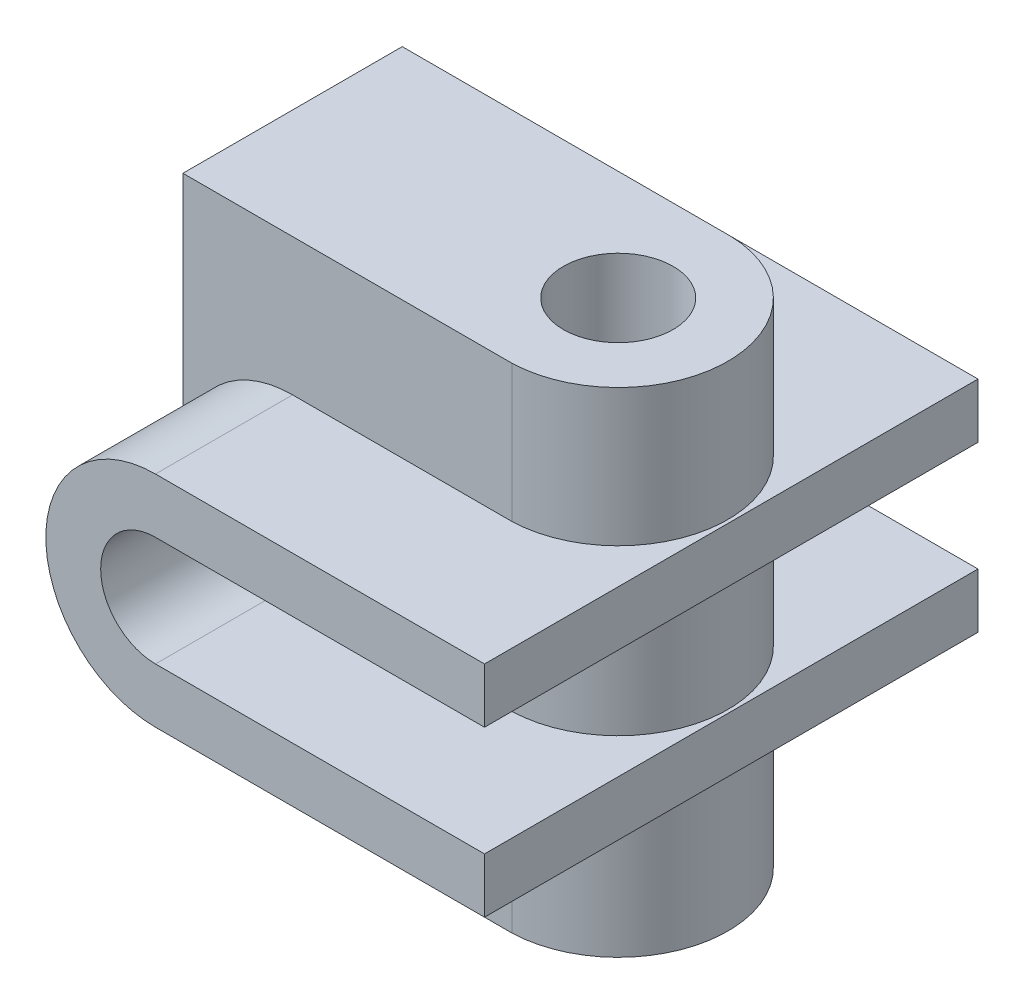
ISO-10303-21;
HEADER;
FILE_DESCRIPTION(('STEP AP214'),'2;1');
FILE_NAME('part.step','',(''),(''),'','','');
FILE_SCHEMA(('AUTOMOTIVE_DESIGN { 1 0 10303 214 1 1 1 1 }'));
ENDSEC;
DATA;
#1=APPLICATION_CONTEXT('core data for automotive mechanical design processes');
#2=APPLICATION_PROTOCOL_DEFINITION('international standard','automotive_design',2000,#1);
#3=PRODUCT_CONTEXT('',#1,'mechanical');
#4=PRODUCT('Part','Part','',(#3));
#5=PRODUCT_RELATED_PRODUCT_CATEGORY('part','',(#4));
#6=PRODUCT_DEFINITION_FORMATION('','',#4);
#7=PRODUCT_DEFINITION_CONTEXT('part definition',#1,'design');
#8=PRODUCT_DEFINITION('design','',#6,#7);
#9=PRODUCT_DEFINITION_SHAPE('','',#8);
#10=(LENGTH_UNIT() NAMED_UNIT(*) SI_UNIT(.MILLI.,.METRE.));
#11=(NAMED_UNIT(*) PLANE_ANGLE_UNIT() SI_UNIT($,.RADIAN.));
#12=(NAMED_UNIT(*) SI_UNIT($,.STERADIAN.) SOLID_ANGLE_UNIT());
#13=UNCERTAINTY_MEASURE_WITH_UNIT(LENGTH_MEASURE(1.E-05),#10,'distance_accuracy_value','');
#14=(GEOMETRIC_REPRESENTATION_CONTEXT(3) GLOBAL_UNCERTAINTY_ASSIGNED_CONTEXT((#13)) GLOBAL_UNIT_ASSIGNED_CONTEXT((#10,
#11,#12)) REPRESENTATION_CONTEXT('',''));
#15=CARTESIAN_POINT('',(0.,0.,0.));
#16=DIRECTION('',(0.,0.,1.));
#17=DIRECTION('',(1.,0.,0.));
#18=AXIS2_PLACEMENT_3D('',#15,#16,#17);
#19=CARTESIAN_POINT('',(0.,0.,90.));
#20=DIRECTION('',(0.,0.,-1.));
#21=DIRECTION('',(-1.,0.,0.));
#22=AXIS2_PLACEMENT_3D('',#19,#20,#21);
#23=CYLINDRICAL_SURFACE('',#22,20.);
#24=CARTESIAN_POINT('',(0.,0.,65.0000000000001));
#25=DIRECTION('',(0.,0.,1.));
#26=DIRECTION('',(1.,0.,0.));
#27=AXIS2_PLACEMENT_3D('',#24,#25,#26);
#28=CIRCLE('',#27,20.);
#29=CARTESIAN_POINT('',(-20.,0.,65.0000000000001));
#30=VERTEX_POINT('',#29);
#31=CARTESIAN_POINT('',(0.,20.,65.0000000000001));
#32=VERTEX_POINT('',#31);
#33=EDGE_CURVE('E284',#30,#32,#28,.F.);
#34=ORIENTED_EDGE('',*,*,#33,.F.);
#35=CARTESIAN_POINT('',(0.,-20.,65.0000000000001));
#36=VERTEX_POINT('',#35);
#37=EDGE_CURVE('E280',#36,#30,#28,.F.);
#38=ORIENTED_EDGE('',*,*,#37,.F.);
#39=DIRECTION('',(0.,0.,-1.));
#40=VECTOR('',#39,1.);
#41=CARTESIAN_POINT('',(0.,-20.,90.));
#42=LINE('',#41,#40);
#43=CARTESIAN_POINT('',(0.,-20.,90.));
#44=VERTEX_POINT('',#43);
#45=EDGE_CURVE('E402',#44,#36,#42,.T.);
#46=ORIENTED_EDGE('',*,*,#45,.F.);
#47=CARTESIAN_POINT('',(0.,0.,90.));
#48=DIRECTION('',(0.,0.,-1.));
#49=DIRECTION('',(1.,0.,0.));
#50=AXIS2_PLACEMENT_3D('',#47,#48,#49);
#51=CIRCLE('',#50,20.);
#52=CARTESIAN_POINT('',(0.,20.,90.));
#53=VERTEX_POINT('',#52);
#54=EDGE_CURVE('E337',#44,#53,#51,.T.);
#55=ORIENTED_EDGE('',*,*,#54,.T.);
#56=DIRECTION('',(0.,0.,-1.));
#57=VECTOR('',#56,1.);
#58=CARTESIAN_POINT('',(0.,20.,90.));
#59=LINE('',#58,#57);
#60=EDGE_CURVE('E406',#53,#32,#59,.T.);
#61=ORIENTED_EDGE('',*,*,#60,.T.);
#62=EDGE_LOOP('',(#34,#38,#46,#55,#61));
#63=FACE_BOUND('',#62,.T.);
#64=ADVANCED_FACE('F46',(#63),#23,.T.);
#65=CARTESIAN_POINT('',(0.,0.,90.));
#66=DIRECTION('',(0.,0.,-1.));
#67=DIRECTION('',(-1.,0.,0.));
#68=AXIS2_PLACEMENT_3D('',#65,#66,#67);
#69=CYLINDRICAL_SURFACE('',#68,10.);
#70=DIRECTION('',(0.,0.,-1.));
#71=VECTOR('',#70,1.);
#72=CARTESIAN_POINT('',(0.,10.,90.));
#73=LINE('',#72,#71);
#74=CARTESIAN_POINT('',(0.,10.,25.0000000000001));
#75=VERTEX_POINT('',#74);
#76=CARTESIAN_POINT('',(0.,10.,0.));
#77=VERTEX_POINT('',#76);
#78=EDGE_CURVE('E355',#75,#77,#73,.T.);
#79=ORIENTED_EDGE('',*,*,#78,.F.);
#80=CARTESIAN_POINT('',(0.,0.,25.0000000000001));
#81=DIRECTION('',(0.,0.,-1.));
#82=DIRECTION('',(-1.,0.,0.));
#83=AXIS2_PLACEMENT_3D('',#80,#81,#82);
#84=CIRCLE('',#83,10.);
#85=CARTESIAN_POINT('',(0.,-10.,25.0000000000001));
#86=VERTEX_POINT('',#85);
#87=EDGE_CURVE('E420',#75,#86,#84,.F.);
#88=ORIENTED_EDGE('',*,*,#87,.T.);
#89=DIRECTION('',(0.,0.,-1.));
#90=VECTOR('',#89,1.);
#91=CARTESIAN_POINT('',(0.,-10.,90.));
#92=LINE('',#91,#90);
#93=CARTESIAN_POINT('',(0.,-10.,0.));
#94=VERTEX_POINT('',#93);
#95=EDGE_CURVE('E390',#86,#94,#92,.T.);
#96=ORIENTED_EDGE('',*,*,#95,.T.);
#97=CARTESIAN_POINT('',(0.,0.,0.));
#98=DIRECTION('',(0.,0.,1.));
#99=DIRECTION('',(1.,0.,0.));
#100=AXIS2_PLACEMENT_3D('',#97,#98,#99);
#101=CIRCLE('',#100,10.);
#102=EDGE_CURVE('E329',#94,#77,#101,.F.);
#103=ORIENTED_EDGE('',*,*,#102,.T.);
#104=EDGE_LOOP('',(#79,#88,#96,#103));
#105=FACE_BOUND('',#104,.T.);
#106=ADVANCED_FACE('F510',(#105),#69,.F.);
#107=CARTESIAN_POINT('',(0.,10.,90.));
#108=DIRECTION('',(0.,1.,0.));
#109=DIRECTION('',(0.,0.,1.));
#110=AXIS2_PLACEMENT_3D('',#107,#108,#109);
#111=PLANE('',#110);
#112=CARTESIAN_POINT('',(39.3871556719854,10.,45.0000000000001));
#113=DIRECTION('',(0.,1.,0.));
#114=DIRECTION('',(0.,0.,1.));
#115=AXIS2_PLACEMENT_3D('',#112,#113,#114);
#116=CIRCLE('',#115,20.0093872512473);
#117=CARTESIAN_POINT('',(40.,9.99999999999999,65.0000000000001));
#118=VERTEX_POINT('',#117);
#119=CARTESIAN_POINT('',(40.,9.99999999999999,25.0000000000001));
#120=VERTEX_POINT('',#119);
#121=EDGE_CURVE('E320',#118,#120,#116,.T.);
#122=ORIENTED_EDGE('',*,*,#121,.T.);
#123=DIRECTION('',(-1.,0.,0.));
#124=VECTOR('',#123,1.);
#125=CARTESIAN_POINT('',(0.,10.,25.0000000000001));
#126=LINE('',#125,#124);
#127=EDGE_CURVE('E292',#120,#75,#126,.T.);
#128=ORIENTED_EDGE('',*,*,#127,.T.);
#129=ORIENTED_EDGE('',*,*,#78,.T.);
#130=DIRECTION('',(1.,0.,0.));
#131=VECTOR('',#130,1.);
#132=CARTESIAN_POINT('',(0.,10.,0.));
#133=LINE('',#132,#131);
#134=CARTESIAN_POINT('',(60.,10.,0.));
#135=VERTEX_POINT('',#134);
#136=EDGE_CURVE('E324',#77,#135,#133,.T.);
#137=ORIENTED_EDGE('',*,*,#136,.T.);
#138=DIRECTION('',(0.,0.,-1.));
#139=VECTOR('',#138,1.);
#140=CARTESIAN_POINT('',(60.,10.,90.));
#141=LINE('',#140,#139);
#142=CARTESIAN_POINT('',(60.,10.,90.));
#143=VERTEX_POINT('',#142);
#144=EDGE_CURVE('E413',#143,#135,#141,.T.);
#145=ORIENTED_EDGE('',*,*,#144,.F.);
#146=DIRECTION('',(1.,0.,0.));
#147=VECTOR('',#146,1.);
#148=CARTESIAN_POINT('',(0.,10.,90.));
#149=LINE('',#148,#147);
#150=CARTESIAN_POINT('',(0.,10.,90.));
#151=VERTEX_POINT('',#150);
#152=EDGE_CURVE('E325',#151,#143,#149,.T.);
#153=ORIENTED_EDGE('',*,*,#152,.F.);
#154=CARTESIAN_POINT('',(0.,10.,65.0000000000001));
#155=VERTEX_POINT('',#154);
#156=EDGE_CURVE('E386',#151,#155,#73,.T.);
#157=ORIENTED_EDGE('',*,*,#156,.T.);
#158=DIRECTION('',(1.,0.,0.));
#159=VECTOR('',#158,1.);
#160=CARTESIAN_POINT('',(0.,10.,65.0000000000001));
#161=LINE('',#160,#159);
#162=EDGE_CURVE('E272',#155,#118,#161,.T.);
#163=ORIENTED_EDGE('',*,*,#162,.T.);
#164=EDGE_LOOP('',(#122,#128,#129,#137,#145,#153,#157,#163));
#165=FACE_BOUND('',#164,.T.);
#166=ADVANCED_FACE('F48',(#165),#111,.F.);
#167=CARTESIAN_POINT('',(60.,20.,90.));
#168=DIRECTION('',(1.,0.,0.));
#169=DIRECTION('',(0.,0.,-1.));
#170=AXIS2_PLACEMENT_3D('',#167,#168,#169);
#171=PLANE('',#170);
#172=DIRECTION('',(0.,-1.,0.));
#173=VECTOR('',#172,1.);
#174=CARTESIAN_POINT('',(60.,20.,0.));
#175=LINE('',#174,#173);
#176=CARTESIAN_POINT('',(60.,20.,0.));
#177=VERTEX_POINT('',#176);
#178=EDGE_CURVE('E359',#177,#135,#175,.T.);
#179=ORIENTED_EDGE('',*,*,#178,.F.);
#180=DIRECTION('',(0.,0.,-1.));
#181=VECTOR('',#180,1.);
#182=CARTESIAN_POINT('',(60.,20.,90.));
#183=LINE('',#182,#181);
#184=CARTESIAN_POINT('',(60.,20.,90.));
#185=VERTEX_POINT('',#184);
#186=EDGE_CURVE('E410',#185,#177,#183,.T.);
#187=ORIENTED_EDGE('',*,*,#186,.F.);
#188=DIRECTION('',(0.,-1.,0.));
#189=VECTOR('',#188,1.);
#190=CARTESIAN_POINT('',(60.,20.,90.));
#191=LINE('',#190,#189);
#192=EDGE_CURVE('E328',#185,#143,#191,.T.);
#193=ORIENTED_EDGE('',*,*,#192,.T.);
#194=ORIENTED_EDGE('',*,*,#144,.T.);
#195=EDGE_LOOP('',(#179,#187,#193,#194));
#196=FACE_BOUND('',#195,.T.);
#197=ADVANCED_FACE('F507',(#196),#171,.T.);
#198=CARTESIAN_POINT('',(0.,20.,90.));
#199=DIRECTION('',(0.,1.,0.));
#200=DIRECTION('',(0.,0.,1.));
#201=AXIS2_PLACEMENT_3D('',#198,#199,#200);
#202=PLANE('',#201);
#203=DIRECTION('',(-1.,0.,0.));
#204=VECTOR('',#203,1.);
#205=CARTESIAN_POINT('',(0.,20.,25.0000000000001));
#206=LINE('',#205,#204);
#207=CARTESIAN_POINT('',(40.,20.,25.0000000000001));
#208=VERTEX_POINT('',#207);
#209=CARTESIAN_POINT('',(0.,20.,25.0000000000001));
#210=VERTEX_POINT('',#209);
#211=EDGE_CURVE('E64',#208,#210,#206,.T.);
#212=ORIENTED_EDGE('',*,*,#211,.F.);
#213=CARTESIAN_POINT('',(39.3871556719854,20.,45.0000000000001));
#214=DIRECTION('',(0.,1.,0.));
#215=DIRECTION('',(0.,0.,1.));
#216=AXIS2_PLACEMENT_3D('',#213,#214,#215);
#217=CIRCLE('',#216,20.0093872512473);
#218=CARTESIAN_POINT('',(40.,20.,65.0000000000001));
#219=VERTEX_POINT('',#218);
#220=EDGE_CURVE('E68',#219,#208,#217,.T.);
#221=ORIENTED_EDGE('',*,*,#220,.F.);
#222=DIRECTION('',(1.,0.,0.));
#223=VECTOR('',#222,1.);
#224=CARTESIAN_POINT('',(0.,20.,65.0000000000001));
#225=LINE('',#224,#223);
#226=EDGE_CURVE('E285',#32,#219,#225,.T.);
#227=ORIENTED_EDGE('',*,*,#226,.F.);
#228=ORIENTED_EDGE('',*,*,#60,.F.);
#229=DIRECTION('',(1.,0.,0.));
#230=VECTOR('',#229,1.);
#231=CARTESIAN_POINT('',(0.,20.,90.));
#232=LINE('',#231,#230);
#233=EDGE_CURVE('E333',#53,#185,#232,.T.);
#234=ORIENTED_EDGE('',*,*,#233,.T.);
#235=ORIENTED_EDGE('',*,*,#186,.T.);
#236=DIRECTION('',(1.,0.,0.));
#237=VECTOR('',#236,1.);
#238=CARTESIAN_POINT('',(0.,20.,0.));
#239=LINE('',#238,#237);
#240=CARTESIAN_POINT('',(0.,20.,0.));
#241=VERTEX_POINT('',#240);
#242=EDGE_CURVE('E363',#241,#177,#239,.T.);
#243=ORIENTED_EDGE('',*,*,#242,.F.);
#244=EDGE_CURVE('E405',#210,#241,#59,.T.);
#245=ORIENTED_EDGE('',*,*,#244,.F.);
#246=EDGE_LOOP('',(#212,#221,#227,#228,#234,#235,#243,#245));
#247=FACE_BOUND('',#246,.T.);
#248=ADVANCED_FACE('F504',(#247),#202,.T.);
#249=CARTESIAN_POINT('',(0.,0.,25.0000000000001));
#250=DIRECTION('',(0.,0.,-1.));
#251=DIRECTION('',(-1.,0.,0.));
#252=AXIS2_PLACEMENT_3D('',#249,#250,#251);
#253=CIRCLE('',#252,20.);
#254=CARTESIAN_POINT('',(-20.,0.,25.0000000000001));
#255=VERTEX_POINT('',#254);
#256=CARTESIAN_POINT('',(0.,-20.,25.0000000000001));
#257=VERTEX_POINT('',#256);
#258=EDGE_CURVE('E300',#255,#257,#253,.F.);
#259=ORIENTED_EDGE('',*,*,#258,.F.);
#260=EDGE_CURVE('E198',#210,#255,#253,.F.);
#261=ORIENTED_EDGE('',*,*,#260,.F.);
#262=ORIENTED_EDGE('',*,*,#244,.T.);
#263=CARTESIAN_POINT('',(0.,0.,0.));
#264=DIRECTION('',(0.,0.,-1.));
#265=DIRECTION('',(1.,0.,0.));
#266=AXIS2_PLACEMENT_3D('',#263,#264,#265);
#267=CIRCLE('',#266,20.);
#268=CARTESIAN_POINT('',(0.,-20.,0.));
#269=VERTEX_POINT('',#268);
#270=EDGE_CURVE('E367',#269,#241,#267,.T.);
#271=ORIENTED_EDGE('',*,*,#270,.F.);
#272=EDGE_CURVE('E401',#257,#269,#42,.T.);
#273=ORIENTED_EDGE('',*,*,#272,.F.);
#274=EDGE_LOOP('',(#259,#261,#262,#271,#273));
#275=FACE_BOUND('',#274,.T.);
#276=ADVANCED_FACE('F499',(#275),#23,.T.);
#277=CARTESIAN_POINT('',(0.,-20.,90.));
#278=DIRECTION('',(0.,-1.,0.));
#279=DIRECTION('',(0.,0.,-1.));
#280=AXIS2_PLACEMENT_3D('',#277,#278,#279);
#281=PLANE('',#280);
#282=DIRECTION('',(1.,0.,0.));
#283=VECTOR('',#282,1.);
#284=CARTESIAN_POINT('',(0.,-20.,25.0000000000001));
#285=LINE('',#284,#283);
#286=CARTESIAN_POINT('',(40.,-20.,25.0000000000001));
#287=VERTEX_POINT('',#286);
#288=EDGE_CURVE('E296',#257,#287,#285,.T.);
#289=ORIENTED_EDGE('',*,*,#288,.F.);
#290=ORIENTED_EDGE('',*,*,#272,.T.);
#291=DIRECTION('',(-1.,0.,0.));
#292=VECTOR('',#291,1.);
#293=CARTESIAN_POINT('',(0.,-20.,0.));
#294=LINE('',#293,#292);
#295=CARTESIAN_POINT('',(60.,-20.,0.));
#296=VERTEX_POINT('',#295);
#297=EDGE_CURVE('E371',#296,#269,#294,.T.);
#298=ORIENTED_EDGE('',*,*,#297,.F.);
#299=DIRECTION('',(0.,0.,-1.));
#300=VECTOR('',#299,1.);
#301=CARTESIAN_POINT('',(60.,-20.,90.));
#302=LINE('',#301,#300);
#303=CARTESIAN_POINT('',(60.,-20.,90.));
#304=VERTEX_POINT('',#303);
#305=EDGE_CURVE('E398',#304,#296,#302,.T.);
#306=ORIENTED_EDGE('',*,*,#305,.F.);
#307=DIRECTION('',(-1.,0.,0.));
#308=VECTOR('',#307,1.);
#309=CARTESIAN_POINT('',(0.,-20.,90.));
#310=LINE('',#309,#308);
#311=EDGE_CURVE('E341',#304,#44,#310,.T.);
#312=ORIENTED_EDGE('',*,*,#311,.T.);
#313=ORIENTED_EDGE('',*,*,#45,.T.);
#314=DIRECTION('',(-1.,0.,0.));
#315=VECTOR('',#314,1.);
#316=CARTESIAN_POINT('',(0.,-20.,65.0000000000001));
#317=LINE('',#316,#315);
#318=CARTESIAN_POINT('',(40.,-20.,65.0000000000001));
#319=VERTEX_POINT('',#318);
#320=EDGE_CURVE('E276',#319,#36,#317,.T.);
#321=ORIENTED_EDGE('',*,*,#320,.F.);
#322=CARTESIAN_POINT('',(39.3871556719854,-20.,45.0000000000001));
#323=DIRECTION('',(0.,-1.,0.));
#324=DIRECTION('',(0.,0.,-1.));
#325=AXIS2_PLACEMENT_3D('',#322,#323,#324);
#326=CIRCLE('',#325,20.0093872512473);
#327=EDGE_CURVE('E313',#287,#319,#326,.T.);
#328=ORIENTED_EDGE('',*,*,#327,.F.);
#329=EDGE_LOOP('',(#289,#290,#298,#306,#312,#313,#321,#328));
#330=FACE_BOUND('',#329,.T.);
#331=ADVANCED_FACE('F487',(#330),#281,.T.);
#332=CARTESIAN_POINT('',(60.,-10.,90.));
#333=DIRECTION('',(1.,0.,0.));
#334=DIRECTION('',(0.,0.,-1.));
#335=AXIS2_PLACEMENT_3D('',#332,#333,#334);
#336=PLANE('',#335);
#337=DIRECTION('',(0.,-1.,0.));
#338=VECTOR('',#337,1.);
#339=CARTESIAN_POINT('',(60.,-10.,0.));
#340=LINE('',#339,#338);
#341=CARTESIAN_POINT('',(60.,-10.,0.));
#342=VERTEX_POINT('',#341);
#343=EDGE_CURVE('E375',#342,#296,#340,.T.);
#344=ORIENTED_EDGE('',*,*,#343,.F.);
#345=DIRECTION('',(0.,0.,-1.));
#346=VECTOR('',#345,1.);
#347=CARTESIAN_POINT('',(60.,-10.,90.));
#348=LINE('',#347,#346);
#349=CARTESIAN_POINT('',(60.,-10.,90.));
#350=VERTEX_POINT('',#349);
#351=EDGE_CURVE('E395',#350,#342,#348,.T.);
#352=ORIENTED_EDGE('',*,*,#351,.F.);
#353=DIRECTION('',(0.,-1.,0.));
#354=VECTOR('',#353,1.);
#355=CARTESIAN_POINT('',(60.,-10.,90.));
#356=LINE('',#355,#354);
#357=EDGE_CURVE('E345',#350,#304,#356,.T.);
#358=ORIENTED_EDGE('',*,*,#357,.T.);
#359=ORIENTED_EDGE('',*,*,#305,.T.);
#360=EDGE_LOOP('',(#344,#352,#358,#359));
#361=FACE_BOUND('',#360,.T.);
#362=ADVANCED_FACE('F468',(#361),#336,.T.);
#363=CARTESIAN_POINT('',(0.,-10.,90.));
#364=DIRECTION('',(0.,-1.,0.));
#365=DIRECTION('',(0.,0.,-1.));
#366=AXIS2_PLACEMENT_3D('',#363,#364,#365);
#367=PLANE('',#366);
#368=ORIENTED_EDGE('',*,*,#95,.F.);
#369=DIRECTION('',(1.,0.,0.));
#370=VECTOR('',#369,1.);
#371=CARTESIAN_POINT('',(0.,-10.,25.0000000000001));
#372=LINE('',#371,#370);
#373=CARTESIAN_POINT('',(40.,-10.,25.0000000000001));
#374=VERTEX_POINT('',#373);
#375=EDGE_CURVE('E288',#86,#374,#372,.T.);
#376=ORIENTED_EDGE('',*,*,#375,.T.);
#377=CARTESIAN_POINT('',(39.3871556719854,-10.,45.0000000000001));
#378=DIRECTION('',(0.,-1.,0.));
#379=DIRECTION('',(0.,0.,-1.));
#380=AXIS2_PLACEMENT_3D('',#377,#378,#379);
#381=CIRCLE('',#380,20.0093872512473);
#382=CARTESIAN_POINT('',(40.,-10.,65.0000000000001));
#383=VERTEX_POINT('',#382);
#384=EDGE_CURVE('E50',#374,#383,#381,.T.);
#385=ORIENTED_EDGE('',*,*,#384,.T.);
#386=DIRECTION('',(-1.,0.,0.));
#387=VECTOR('',#386,1.);
#388=CARTESIAN_POINT('',(0.,-10.,65.0000000000001));
#389=LINE('',#388,#387);
#390=CARTESIAN_POINT('',(0.,-10.,65.0000000000001));
#391=VERTEX_POINT('',#390);
#392=EDGE_CURVE('E256',#383,#391,#389,.T.);
#393=ORIENTED_EDGE('',*,*,#392,.T.);
#394=CARTESIAN_POINT('',(0.,-10.,90.));
#395=VERTEX_POINT('',#394);
#396=EDGE_CURVE('E391',#395,#391,#92,.T.);
#397=ORIENTED_EDGE('',*,*,#396,.F.);
#398=DIRECTION('',(1.,0.,0.));
#399=VECTOR('',#398,1.);
#400=CARTESIAN_POINT('',(0.,-10.,90.));
#401=LINE('',#400,#399);
#402=EDGE_CURVE('E349',#350,#395,#401,.F.);
#403=ORIENTED_EDGE('',*,*,#402,.F.);
#404=ORIENTED_EDGE('',*,*,#351,.T.);
#405=DIRECTION('',(1.,0.,0.));
#406=VECTOR('',#405,1.);
#407=CARTESIAN_POINT('',(0.,-10.,0.));
#408=LINE('',#407,#406);
#409=EDGE_CURVE('E379',#342,#94,#408,.F.);
#410=ORIENTED_EDGE('',*,*,#409,.T.);
#411=EDGE_LOOP('',(#368,#376,#385,#393,#397,#403,#404,#410));
#412=FACE_BOUND('',#411,.T.);
#413=ADVANCED_FACE('F432',(#412),#367,.F.);
#414=ORIENTED_EDGE('',*,*,#396,.T.);
#415=CARTESIAN_POINT('',(0.,0.,65.0000000000001));
#416=DIRECTION('',(0.,0.,1.));
#417=DIRECTION('',(1.,0.,0.));
#418=AXIS2_PLACEMENT_3D('',#415,#416,#417);
#419=CIRCLE('',#418,10.);
#420=EDGE_CURVE('E416',#391,#155,#419,.F.);
#421=ORIENTED_EDGE('',*,*,#420,.T.);
#422=ORIENTED_EDGE('',*,*,#156,.F.);
#423=CARTESIAN_POINT('',(0.,0.,90.));
#424=DIRECTION('',(0.,0.,1.));
#425=DIRECTION('',(1.,0.,0.));
#426=AXIS2_PLACEMENT_3D('',#423,#424,#425);
#427=CIRCLE('',#426,10.);
#428=EDGE_CURVE('E352',#395,#151,#427,.F.);
#429=ORIENTED_EDGE('',*,*,#428,.F.);
#430=EDGE_LOOP('',(#414,#421,#422,#429));
#431=FACE_BOUND('',#430,.T.);
#432=ADVANCED_FACE('F458',(#431),#69,.F.);
#433=CARTESIAN_POINT('',(0.,0.,90.));
#434=DIRECTION('',(0.,0.,-1.));
#435=DIRECTION('',(-1.,0.,0.));
#436=AXIS2_PLACEMENT_3D('',#433,#434,#435);
#437=PLANE('',#436);
#438=ORIENTED_EDGE('',*,*,#152,.T.);
#439=ORIENTED_EDGE('',*,*,#192,.F.);
#440=ORIENTED_EDGE('',*,*,#233,.F.);
#441=ORIENTED_EDGE('',*,*,#54,.F.);
#442=ORIENTED_EDGE('',*,*,#311,.F.);
#443=ORIENTED_EDGE('',*,*,#357,.F.);
#444=ORIENTED_EDGE('',*,*,#402,.T.);
#445=ORIENTED_EDGE('',*,*,#428,.T.);
#446=EDGE_LOOP('',(#438,#439,#440,#441,#442,#443,#444,#445));
#447=FACE_BOUND('',#446,.T.);
#448=ADVANCED_FACE('F464',(#447),#437,.F.);
#449=CARTESIAN_POINT('',(0.,0.,0.));
#450=DIRECTION('',(0.,0.,-1.));
#451=DIRECTION('',(-1.,0.,0.));
#452=AXIS2_PLACEMENT_3D('',#449,#450,#451);
#453=PLANE('',#452);
#454=ORIENTED_EDGE('',*,*,#136,.F.);
#455=ORIENTED_EDGE('',*,*,#102,.F.);
#456=ORIENTED_EDGE('',*,*,#409,.F.);
#457=ORIENTED_EDGE('',*,*,#343,.T.);
#458=ORIENTED_EDGE('',*,*,#297,.T.);
#459=ORIENTED_EDGE('',*,*,#270,.T.);
#460=ORIENTED_EDGE('',*,*,#242,.T.);
#461=ORIENTED_EDGE('',*,*,#178,.T.);
#462=EDGE_LOOP('',(#454,#455,#456,#457,#458,#459,#460,#461));
#463=FACE_BOUND('',#462,.T.);
#464=ADVANCED_FACE('F472',(#463),#453,.T.);
#465=CARTESIAN_POINT('',(-20.,-45.,25.0000000000001));
#466=DIRECTION('',(0.,0.,-1.));
#467=DIRECTION('',(-1.,0.,0.));
#468=AXIS2_PLACEMENT_3D('',#465,#466,#467);
#469=PLANE('',#468);
#470=ORIENTED_EDGE('',*,*,#127,.F.);
#471=DIRECTION('',(0.,1.,0.));
#472=VECTOR('',#471,1.);
#473=CARTESIAN_POINT('',(40.,-45.,25.0000000000001));
#474=LINE('',#473,#472);
#475=EDGE_CURVE('E257',#374,#120,#474,.T.);
#476=ORIENTED_EDGE('',*,*,#475,.F.);
#477=ORIENTED_EDGE('',*,*,#375,.F.);
#478=ORIENTED_EDGE('',*,*,#87,.F.);
#479=EDGE_LOOP('',(#470,#476,#477,#478));
#480=FACE_BOUND('',#479,.T.);
#481=ADVANCED_FACE('F441',(#480),#469,.T.);
#482=CARTESIAN_POINT('',(-20.,-45.,65.0000000000001));
#483=DIRECTION('',(0.,0.,1.));
#484=DIRECTION('',(1.,0.,0.));
#485=AXIS2_PLACEMENT_3D('',#482,#483,#484);
#486=PLANE('',#485);
#487=ORIENTED_EDGE('',*,*,#162,.F.);
#488=ORIENTED_EDGE('',*,*,#420,.F.);
#489=ORIENTED_EDGE('',*,*,#392,.F.);
#490=DIRECTION('',(0.,1.,0.));
#491=VECTOR('',#490,1.);
#492=CARTESIAN_POINT('',(40.,-45.,65.0000000000001));
#493=LINE('',#492,#491);
#494=EDGE_CURVE('E263',#383,#118,#493,.T.);
#495=ORIENTED_EDGE('',*,*,#494,.T.);
#496=EDGE_LOOP('',(#487,#488,#489,#495));
#497=FACE_BOUND('',#496,.T.);
#498=ADVANCED_FACE('F451',(#497),#486,.T.);
#499=CARTESIAN_POINT('',(39.3871556719854,-45.,45.0000000000001));
#500=DIRECTION('',(0.,1.,0.));
#501=DIRECTION('',(0.,0.,1.));
#502=AXIS2_PLACEMENT_3D('',#499,#500,#501);
#503=CYLINDRICAL_SURFACE('',#502,20.0093872512473);
#504=ORIENTED_EDGE('',*,*,#121,.F.);
#505=ORIENTED_EDGE('',*,*,#494,.F.);
#506=ORIENTED_EDGE('',*,*,#384,.F.);
#507=ORIENTED_EDGE('',*,*,#475,.T.);
#508=EDGE_LOOP('',(#504,#505,#506,#507));
#509=FACE_BOUND('',#508,.T.);
#510=ADVANCED_FACE('F438',(#509),#503,.T.);
#511=CARTESIAN_POINT('',(-20.,-45.,25.0000000000001));
#512=DIRECTION('',(-1.,0.,0.));
#513=DIRECTION('',(0.,0.,1.));
#514=AXIS2_PLACEMENT_3D('',#511,#512,#513);
#515=PLANE('',#514);
#516=DIRECTION('',(0.,1.,0.));
#517=VECTOR('',#516,1.);
#518=CARTESIAN_POINT('',(-20.,-45.,65.0000000000001));
#519=LINE('',#518,#517);
#520=CARTESIAN_POINT('',(-20.,-45.,65.0000000000001));
#521=VERTEX_POINT('',#520);
#522=EDGE_CURVE('E265',#521,#30,#519,.T.);
#523=ORIENTED_EDGE('',*,*,#522,.T.);
#524=CARTESIAN_POINT('',(-20.,45.,65.0000000000001));
#525=VERTEX_POINT('',#524);
#526=EDGE_CURVE('E210',#30,#525,#519,.T.);
#527=ORIENTED_EDGE('',*,*,#526,.T.);
#528=DIRECTION('',(0.,0.,1.));
#529=VECTOR('',#528,1.);
#530=CARTESIAN_POINT('',(-20.,45.,25.0000000000001));
#531=LINE('',#530,#529);
#532=CARTESIAN_POINT('',(-20.,45.,25.0000000000001));
#533=VERTEX_POINT('',#532);
#534=EDGE_CURVE('E206',#533,#525,#531,.T.);
#535=ORIENTED_EDGE('',*,*,#534,.F.);
#536=DIRECTION('',(0.,1.,0.));
#537=VECTOR('',#536,1.);
#538=CARTESIAN_POINT('',(-20.,-45.,25.0000000000001));
#539=LINE('',#538,#537);
#540=EDGE_CURVE('E192',#255,#533,#539,.T.);
#541=ORIENTED_EDGE('',*,*,#540,.F.);
#542=CARTESIAN_POINT('',(-20.,-45.,25.0000000000001));
#543=VERTEX_POINT('',#542);
#544=EDGE_CURVE('E202',#543,#255,#539,.T.);
#545=ORIENTED_EDGE('',*,*,#544,.F.);
#546=DIRECTION('',(0.,0.,1.));
#547=VECTOR('',#546,1.);
#548=CARTESIAN_POINT('',(-20.,-45.,25.0000000000001));
#549=LINE('',#548,#547);
#550=EDGE_CURVE('E241',#543,#521,#549,.T.);
#551=ORIENTED_EDGE('',*,*,#550,.T.);
#552=EDGE_LOOP('',(#523,#527,#535,#541,#545,#551));
#553=FACE_BOUND('',#552,.T.);
#554=ADVANCED_FACE('F208',(#553),#515,.T.);
#555=CARTESIAN_POINT('',(40.,45.,65.0000000000001));
#556=VERTEX_POINT('',#555);
#557=EDGE_CURVE('E264',#219,#556,#493,.T.);
#558=ORIENTED_EDGE('',*,*,#557,.F.);
#559=ORIENTED_EDGE('',*,*,#220,.T.);
#560=CARTESIAN_POINT('',(40.,45.,25.0000000000001));
#561=VERTEX_POINT('',#560);
#562=EDGE_CURVE('E258',#208,#561,#474,.T.);
#563=ORIENTED_EDGE('',*,*,#562,.T.);
#564=CARTESIAN_POINT('',(39.3871556719854,45.,45.0000000000001));
#565=DIRECTION('',(0.,1.,0.));
#566=DIRECTION('',(0.,0.,-1.));
#567=AXIS2_PLACEMENT_3D('',#564,#565,#566);
#568=CIRCLE('',#567,20.0093872512473);
#569=EDGE_CURVE('E221',#556,#561,#568,.T.);
#570=ORIENTED_EDGE('',*,*,#569,.F.);
#571=EDGE_LOOP('',(#558,#559,#563,#570));
#572=FACE_BOUND('',#571,.T.);
#573=ADVANCED_FACE('F446',(#572),#503,.T.);
#574=CARTESIAN_POINT('',(39.3871556719854,-45.,45.0000000000001));
#575=DIRECTION('',(0.,1.,0.));
#576=DIRECTION('',(0.,0.,1.));
#577=AXIS2_PLACEMENT_3D('',#574,#575,#576);
#578=CYLINDRICAL_SURFACE('',#577,10.);
#579=CARTESIAN_POINT('',(39.3871556719854,20.,45.0000000000001));
#580=DIRECTION('',(0.,1.,0.));
#581=DIRECTION('',(0.,0.,1.));
#582=AXIS2_PLACEMENT_3D('',#579,#580,#581);
#583=CIRCLE('',#582,10.);
#584=CARTESIAN_POINT('',(39.3871556719854,20.,55.0000000000001));
#585=VERTEX_POINT('',#584);
#586=EDGE_CURVE('E310',#585,#585,#583,.T.);
#587=CARTESIAN_POINT('',(39.3871556719854,45.,45.0000000000001));
#588=DIRECTION('',(0.,1.,0.));
#589=DIRECTION('',(0.,0.,1.));
#590=AXIS2_PLACEMENT_3D('',#587,#588,#589);
#591=CIRCLE('',#590,10.);
#592=CARTESIAN_POINT('',(39.3871556719854,45.,55.0000000000001));
#593=VERTEX_POINT('',#592);
#594=EDGE_CURVE('E223',#593,#593,#591,.T.);
#595=CARTESIAN_POINT('',(39.3871556719854,20.,55.0000000000001));
#596=CARTESIAN_POINT('',(39.3871556719854,20.2604166666667,55.0000000000001));
#597=CARTESIAN_POINT('',(39.3871556719854,20.5208333333333,55.0000000000001));
#598=CARTESIAN_POINT('',(39.3871556719854,21.0416666666667,55.0000000000001));
#599=CARTESIAN_POINT('',(39.3871556719854,21.3020833333333,55.0000000000001));
#600=CARTESIAN_POINT('',(39.3871556719854,21.8229166666667,55.0000000000001));
#601=CARTESIAN_POINT('',(39.3871556719854,22.0833333333333,55.0000000000001));
#602=CARTESIAN_POINT('',(39.3871556719854,22.6041666666667,55.0000000000001));
#603=CARTESIAN_POINT('',(39.3871556719854,22.8645833333333,55.0000000000001));
#604=CARTESIAN_POINT('',(39.3871556719854,23.3854166666667,55.0000000000001));
#605=CARTESIAN_POINT('',(39.3871556719854,23.6458333333333,55.0000000000001));
#606=CARTESIAN_POINT('',(39.3871556719854,24.1666666666667,55.0000000000001));
#607=CARTESIAN_POINT('',(39.3871556719854,24.4270833333333,55.0000000000001));
#608=CARTESIAN_POINT('',(39.3871556719854,24.9479166666667,55.0000000000001));
#609=CARTESIAN_POINT('',(39.3871556719854,25.2083333333333,55.0000000000001));
#610=CARTESIAN_POINT('',(39.3871556719854,25.7291666666667,55.0000000000001));
#611=CARTESIAN_POINT('',(39.3871556719854,25.9895833333333,55.0000000000001));
#612=CARTESIAN_POINT('',(39.3871556719854,26.5104166666667,55.0000000000001));
#613=CARTESIAN_POINT('',(39.3871556719854,26.7708333333333,55.0000000000001));
#614=CARTESIAN_POINT('',(39.3871556719854,27.2916666666667,55.0000000000001));
#615=CARTESIAN_POINT('',(39.3871556719854,27.5520833333333,55.0000000000001));
#616=CARTESIAN_POINT('',(39.3871556719854,28.0729166666667,55.0000000000001));
#617=CARTESIAN_POINT('',(39.3871556719854,28.3333333333333,55.0000000000001));
#618=CARTESIAN_POINT('',(39.3871556719854,28.8541666666667,55.0000000000001));
#619=CARTESIAN_POINT('',(39.3871556719854,29.1145833333333,55.0000000000001));
#620=CARTESIAN_POINT('',(39.3871556719854,29.6354166666667,55.0000000000001));
#621=CARTESIAN_POINT('',(39.3871556719854,29.8958333333333,55.0000000000001));
#622=CARTESIAN_POINT('',(39.3871556719854,30.4166666666667,55.0000000000001));
#623=CARTESIAN_POINT('',(39.3871556719854,30.6770833333333,55.0000000000001));
#624=CARTESIAN_POINT('',(39.3871556719854,31.1979166666667,55.0000000000001));
#625=CARTESIAN_POINT('',(39.3871556719854,31.4583333333333,55.0000000000001));
#626=CARTESIAN_POINT('',(39.3871556719854,31.9791666666667,55.0000000000001));
#627=CARTESIAN_POINT('',(39.3871556719854,32.2395833333333,55.0000000000001));
#628=CARTESIAN_POINT('',(39.3871556719854,32.7604166666667,55.0000000000001));
#629=CARTESIAN_POINT('',(39.3871556719854,33.0208333333333,55.0000000000001));
#630=CARTESIAN_POINT('',(39.3871556719854,33.5416666666667,55.0000000000001));
#631=CARTESIAN_POINT('',(39.3871556719854,33.8020833333333,55.0000000000001));
#632=CARTESIAN_POINT('',(39.3871556719854,34.3229166666667,55.0000000000001));
#633=CARTESIAN_POINT('',(39.3871556719854,34.5833333333333,55.0000000000001));
#634=CARTESIAN_POINT('',(39.3871556719854,35.1041666666667,55.0000000000001));
#635=CARTESIAN_POINT('',(39.3871556719854,35.3645833333333,55.0000000000001));
#636=CARTESIAN_POINT('',(39.3871556719854,35.8854166666667,55.0000000000001));
#637=CARTESIAN_POINT('',(39.3871556719854,36.1458333333333,55.0000000000001));
#638=CARTESIAN_POINT('',(39.3871556719854,36.6666666666667,55.0000000000001));
#639=CARTESIAN_POINT('',(39.3871556719854,36.9270833333333,55.0000000000001));
#640=CARTESIAN_POINT('',(39.3871556719854,37.4479166666667,55.0000000000001));
#641=CARTESIAN_POINT('',(39.3871556719854,37.7083333333333,55.0000000000001));
#642=CARTESIAN_POINT('',(39.3871556719854,38.2291666666667,55.0000000000001));
#643=CARTESIAN_POINT('',(39.3871556719854,38.4895833333333,55.0000000000001));
#644=CARTESIAN_POINT('',(39.3871556719854,39.0104166666667,55.0000000000001));
#645=CARTESIAN_POINT('',(39.3871556719854,39.2708333333333,55.0000000000001));
#646=CARTESIAN_POINT('',(39.3871556719854,39.7916666666667,55.0000000000001));
#647=CARTESIAN_POINT('',(39.3871556719854,40.0520833333333,55.0000000000001));
#648=CARTESIAN_POINT('',(39.3871556719854,40.5729166666667,55.0000000000001));
#649=CARTESIAN_POINT('',(39.3871556719854,40.8333333333333,55.0000000000001));
#650=CARTESIAN_POINT('',(39.3871556719854,41.3541666666667,55.0000000000001));
#651=CARTESIAN_POINT('',(39.3871556719854,41.6145833333333,55.0000000000001));
#652=CARTESIAN_POINT('',(39.3871556719854,42.1354166666667,55.0000000000001));
#653=CARTESIAN_POINT('',(39.3871556719854,42.3958333333333,55.0000000000001));
#654=CARTESIAN_POINT('',(39.3871556719854,42.9166666666667,55.0000000000001));
#655=CARTESIAN_POINT('',(39.3871556719854,43.1770833333333,55.0000000000001));
#656=CARTESIAN_POINT('',(39.3871556719854,43.6979166666667,55.0000000000001));
#657=CARTESIAN_POINT('',(39.3871556719854,43.9583333333333,55.0000000000001));
#658=CARTESIAN_POINT('',(39.3871556719854,44.4791666666667,55.0000000000001));
#659=CARTESIAN_POINT('',(39.3871556719854,44.7395833333333,55.0000000000001));
#660=CARTESIAN_POINT('',(39.3871556719854,45.,55.0000000000001));
#661=B_SPLINE_CURVE_WITH_KNOTS('',3,(#595,#596,#597,#598,#599,#600,#601,#602,#603,#604,#605,
#606,#607,#608,#609,#610,#611,#612,#613,#614,#615,#616,#617,#618,#619,#620,#621,#622,#623,#624,
#625,#626,#627,#628,#629,#630,#631,#632,#633,#634,#635,#636,#637,#638,#639,#640,#641,#642,#643,
#644,#645,#646,#647,#648,#649,#650,#651,#652,#653,#654,#655,#656,#657,#658,#659,#660),
.UNSPECIFIED.,.F.,.F.,(4,2,2,2,2,2,2,2,2,2,2,2,2,2,2,2,2,2,2,2,2,2,2,2,2,2,2,2,2,2,2,2,4),(0.,
0.781249999999997,1.56249999999999,2.34375000000001,3.125,3.90625,4.6875,5.46874999999999,
6.25000000000001,7.03125,7.8125,8.59375,9.37499999999999,10.15625,10.9375,11.71875,12.5,
13.28125,14.0625,14.84375,15.625,16.40625,17.1875,17.96875,18.75,19.53125,20.3125,21.09375,
21.875,22.65625,23.4375,24.21875,25.),.UNSPECIFIED.);
#662=EDGE_CURVE('BSEAM544',#585,#593,#661,.T.);
#663=ORIENTED_EDGE('',*,*,#586,.F.);
#664=ORIENTED_EDGE('',*,*,#594,.T.);
#665=ORIENTED_EDGE('',*,*,#662,.T.);
#666=ORIENTED_EDGE('',*,*,#662,.F.);
#667=EDGE_LOOP('',(#663,#665,#664,#666));
#668=FACE_BOUND('',#667,.T.);
#669=ADVANCED_FACE('F544',(#668),#578,.F.);
#670=ORIENTED_EDGE('',*,*,#562,.F.);
#671=ORIENTED_EDGE('',*,*,#211,.T.);
#672=ORIENTED_EDGE('',*,*,#260,.T.);
#673=ORIENTED_EDGE('',*,*,#540,.T.);
#674=DIRECTION('',(-1.,0.,0.));
#675=VECTOR('',#674,1.);
#676=CARTESIAN_POINT('',(-20.,45.,25.0000000000001));
#677=LINE('',#676,#675);
#678=EDGE_CURVE('E197',#561,#533,#677,.T.);
#679=ORIENTED_EDGE('',*,*,#678,.F.);
#680=EDGE_LOOP('',(#670,#671,#672,#673,#679));
#681=FACE_BOUND('',#680,.T.);
#682=ADVANCED_FACE('F195',(#681),#469,.T.);
#683=ORIENTED_EDGE('',*,*,#33,.T.);
#684=ORIENTED_EDGE('',*,*,#226,.T.);
#685=ORIENTED_EDGE('',*,*,#557,.T.);
#686=DIRECTION('',(1.,0.,0.));
#687=VECTOR('',#686,1.);
#688=CARTESIAN_POINT('',(-20.,45.,65.0000000000001));
#689=LINE('',#688,#687);
#690=EDGE_CURVE('E215',#525,#556,#689,.T.);
#691=ORIENTED_EDGE('',*,*,#690,.F.);
#692=ORIENTED_EDGE('',*,*,#526,.F.);
#693=EDGE_LOOP('',(#683,#684,#685,#691,#692));
#694=FACE_BOUND('',#693,.T.);
#695=ADVANCED_FACE('F480',(#694),#486,.T.);
#696=ORIENTED_EDGE('',*,*,#544,.T.);
#697=ORIENTED_EDGE('',*,*,#258,.T.);
#698=ORIENTED_EDGE('',*,*,#288,.T.);
#699=CARTESIAN_POINT('',(40.,-45.,25.0000000000001));
#700=VERTEX_POINT('',#699);
#701=EDGE_CURVE('E252',#700,#287,#474,.T.);
#702=ORIENTED_EDGE('',*,*,#701,.F.);
#703=DIRECTION('',(-1.,0.,0.));
#704=VECTOR('',#703,1.);
#705=CARTESIAN_POINT('',(-20.,-45.,25.0000000000001));
#706=LINE('',#705,#704);
#707=EDGE_CURVE('E237',#700,#543,#706,.T.);
#708=ORIENTED_EDGE('',*,*,#707,.T.);
#709=EDGE_LOOP('',(#696,#697,#698,#702,#708));
#710=FACE_BOUND('',#709,.T.);
#711=ADVANCED_FACE('F493',(#710),#469,.T.);
#712=ORIENTED_EDGE('',*,*,#701,.T.);
#713=ORIENTED_EDGE('',*,*,#327,.T.);
#714=CARTESIAN_POINT('',(40.,-45.,65.0000000000001));
#715=VERTEX_POINT('',#714);
#716=EDGE_CURVE('E259',#715,#319,#493,.T.);
#717=ORIENTED_EDGE('',*,*,#716,.F.);
#718=CARTESIAN_POINT('',(39.3871556719854,-45.,45.0000000000001));
#719=DIRECTION('',(0.,1.,0.));
#720=DIRECTION('',(0.,0.,-1.));
#721=AXIS2_PLACEMENT_3D('',#718,#719,#720);
#722=CIRCLE('',#721,20.0093872512473);
#723=EDGE_CURVE('E203',#715,#700,#722,.T.);
#724=ORIENTED_EDGE('',*,*,#723,.T.);
#725=EDGE_LOOP('',(#712,#713,#717,#724));
#726=FACE_BOUND('',#725,.T.);
#727=ADVANCED_FACE('F489',(#726),#503,.T.);
#728=ORIENTED_EDGE('',*,*,#320,.T.);
#729=ORIENTED_EDGE('',*,*,#37,.T.);
#730=ORIENTED_EDGE('',*,*,#522,.F.);
#731=DIRECTION('',(1.,0.,0.));
#732=VECTOR('',#731,1.);
#733=CARTESIAN_POINT('',(-20.,-45.,65.0000000000001));
#734=LINE('',#733,#732);
#735=EDGE_CURVE('E245',#521,#715,#734,.T.);
#736=ORIENTED_EDGE('',*,*,#735,.T.);
#737=ORIENTED_EDGE('',*,*,#716,.T.);
#738=EDGE_LOOP('',(#728,#729,#730,#736,#737));
#739=FACE_BOUND('',#738,.T.);
#740=ADVANCED_FACE('F484',(#739),#486,.T.);
#741=CARTESIAN_POINT('',(39.3871556719854,-45.,45.0000000000001));
#742=DIRECTION('',(0.,-1.,0.));
#743=DIRECTION('',(0.,0.,-1.));
#744=AXIS2_PLACEMENT_3D('',#741,#742,#743);
#745=PLANE('',#744);
#746=CARTESIAN_POINT('',(39.3871556719854,-45.,45.0000000000001));
#747=DIRECTION('',(0.,1.,0.));
#748=DIRECTION('',(0.,0.,1.));
#749=AXIS2_PLACEMENT_3D('',#746,#747,#748);
#750=CIRCLE('',#749,10.);
#751=CARTESIAN_POINT('',(39.3871556719854,-45.,55.0000000000001));
#752=VERTEX_POINT('',#751);
#753=EDGE_CURVE('E233',#752,#752,#750,.T.);
#754=ORIENTED_EDGE('',*,*,#753,.T.);
#755=EDGE_LOOP('',(#754));
#756=FACE_BOUND('',#755,.T.);
#757=ORIENTED_EDGE('',*,*,#707,.F.);
#758=ORIENTED_EDGE('',*,*,#723,.F.);
#759=ORIENTED_EDGE('',*,*,#735,.F.);
#760=ORIENTED_EDGE('',*,*,#550,.F.);
#761=EDGE_LOOP('',(#757,#758,#759,#760));
#762=FACE_BOUND('',#761,.T.);
#763=ADVANCED_FACE('F496',(#756,#762),#745,.T.);
#764=CARTESIAN_POINT('',(39.3871556719854,-20.,45.0000000000001));
#765=DIRECTION('',(0.,-1.,0.));
#766=DIRECTION('',(0.,0.,-1.));
#767=AXIS2_PLACEMENT_3D('',#764,#765,#766);
#768=CIRCLE('',#767,10.);
#769=CARTESIAN_POINT('',(39.3871556719854,-20.,55.0000000000001));
#770=VERTEX_POINT('',#769);
#771=EDGE_CURVE('E306',#770,#770,#768,.T.);
#772=CARTESIAN_POINT('',(39.3871556719854,-20.,55.0000000000001));
#773=CARTESIAN_POINT('',(39.3871556719854,-20.2604166666667,55.0000000000001));
#774=CARTESIAN_POINT('',(39.3871556719854,-20.5208333333333,55.0000000000001));
#775=CARTESIAN_POINT('',(39.3871556719854,-21.0416666666667,55.0000000000001));
#776=CARTESIAN_POINT('',(39.3871556719854,-21.3020833333333,55.0000000000001));
#777=CARTESIAN_POINT('',(39.3871556719854,-21.8229166666667,55.0000000000001));
#778=CARTESIAN_POINT('',(39.3871556719854,-22.0833333333333,55.0000000000001));
#779=CARTESIAN_POINT('',(39.3871556719854,-22.6041666666667,55.0000000000001));
#780=CARTESIAN_POINT('',(39.3871556719854,-22.8645833333333,55.0000000000001));
#781=CARTESIAN_POINT('',(39.3871556719854,-23.3854166666667,55.0000000000001));
#782=CARTESIAN_POINT('',(39.3871556719854,-23.6458333333333,55.0000000000001));
#783=CARTESIAN_POINT('',(39.3871556719854,-24.1666666666667,55.0000000000001));
#784=CARTESIAN_POINT('',(39.3871556719854,-24.4270833333333,55.0000000000001));
#785=CARTESIAN_POINT('',(39.3871556719854,-24.9479166666667,55.0000000000001));
#786=CARTESIAN_POINT('',(39.3871556719854,-25.2083333333333,55.0000000000001));
#787=CARTESIAN_POINT('',(39.3871556719854,-25.7291666666667,55.0000000000001));
#788=CARTESIAN_POINT('',(39.3871556719854,-25.9895833333333,55.0000000000001));
#789=CARTESIAN_POINT('',(39.3871556719854,-26.5104166666667,55.0000000000001));
#790=CARTESIAN_POINT('',(39.3871556719854,-26.7708333333333,55.0000000000001));
#791=CARTESIAN_POINT('',(39.3871556719854,-27.2916666666667,55.0000000000001));
#792=CARTESIAN_POINT('',(39.3871556719854,-27.5520833333333,55.0000000000001));
#793=CARTESIAN_POINT('',(39.3871556719854,-28.0729166666667,55.0000000000001));
#794=CARTESIAN_POINT('',(39.3871556719854,-28.3333333333333,55.0000000000001));
#795=CARTESIAN_POINT('',(39.3871556719854,-28.8541666666667,55.0000000000001));
#796=CARTESIAN_POINT('',(39.3871556719854,-29.1145833333333,55.0000000000001));
#797=CARTESIAN_POINT('',(39.3871556719854,-29.6354166666667,55.0000000000001));
#798=CARTESIAN_POINT('',(39.3871556719854,-29.8958333333333,55.0000000000001));
#799=CARTESIAN_POINT('',(39.3871556719854,-30.4166666666667,55.0000000000001));
#800=CARTESIAN_POINT('',(39.3871556719854,-30.6770833333333,55.0000000000001));
#801=CARTESIAN_POINT('',(39.3871556719854,-31.1979166666667,55.0000000000001));
#802=CARTESIAN_POINT('',(39.3871556719854,-31.4583333333333,55.0000000000001));
#803=CARTESIAN_POINT('',(39.3871556719854,-31.9791666666667,55.0000000000001));
#804=CARTESIAN_POINT('',(39.3871556719854,-32.2395833333333,55.0000000000001));
#805=CARTESIAN_POINT('',(39.3871556719854,-32.7604166666667,55.0000000000001));
#806=CARTESIAN_POINT('',(39.3871556719854,-33.0208333333333,55.0000000000001));
#807=CARTESIAN_POINT('',(39.3871556719854,-33.5416666666667,55.0000000000001));
#808=CARTESIAN_POINT('',(39.3871556719854,-33.8020833333333,55.0000000000001));
#809=CARTESIAN_POINT('',(39.3871556719854,-34.3229166666667,55.0000000000001));
#810=CARTESIAN_POINT('',(39.3871556719854,-34.5833333333333,55.0000000000001));
#811=CARTESIAN_POINT('',(39.3871556719854,-35.1041666666667,55.0000000000001));
#812=CARTESIAN_POINT('',(39.3871556719854,-35.3645833333333,55.0000000000001));
#813=CARTESIAN_POINT('',(39.3871556719854,-35.8854166666667,55.0000000000001));
#814=CARTESIAN_POINT('',(39.3871556719854,-36.1458333333333,55.0000000000001));
#815=CARTESIAN_POINT('',(39.3871556719854,-36.6666666666667,55.0000000000001));
#816=CARTESIAN_POINT('',(39.3871556719854,-36.9270833333333,55.0000000000001));
#817=CARTESIAN_POINT('',(39.3871556719854,-37.4479166666667,55.0000000000001));
#818=CARTESIAN_POINT('',(39.3871556719854,-37.7083333333333,55.0000000000001));
#819=CARTESIAN_POINT('',(39.3871556719854,-38.2291666666667,55.0000000000001));
#820=CARTESIAN_POINT('',(39.3871556719854,-38.4895833333333,55.0000000000001));
#821=CARTESIAN_POINT('',(39.3871556719854,-39.0104166666667,55.0000000000001));
#822=CARTESIAN_POINT('',(39.3871556719854,-39.2708333333333,55.0000000000001));
#823=CARTESIAN_POINT('',(39.3871556719854,-39.7916666666667,55.0000000000001));
#824=CARTESIAN_POINT('',(39.3871556719854,-40.0520833333333,55.0000000000001));
#825=CARTESIAN_POINT('',(39.3871556719854,-40.5729166666667,55.0000000000001));
#826=CARTESIAN_POINT('',(39.3871556719854,-40.8333333333333,55.0000000000001));
#827=CARTESIAN_POINT('',(39.3871556719854,-41.3541666666667,55.0000000000001));
#828=CARTESIAN_POINT('',(39.3871556719854,-41.6145833333333,55.0000000000001));
#829=CARTESIAN_POINT('',(39.3871556719854,-42.1354166666667,55.0000000000001));
#830=CARTESIAN_POINT('',(39.3871556719854,-42.3958333333333,55.0000000000001));
#831=CARTESIAN_POINT('',(39.3871556719854,-42.9166666666667,55.0000000000001));
#832=CARTESIAN_POINT('',(39.3871556719854,-43.1770833333333,55.0000000000001));
#833=CARTESIAN_POINT('',(39.3871556719854,-43.6979166666667,55.0000000000001));
#834=CARTESIAN_POINT('',(39.3871556719854,-43.9583333333333,55.0000000000001));
#835=CARTESIAN_POINT('',(39.3871556719854,-44.4791666666667,55.0000000000001));
#836=CARTESIAN_POINT('',(39.3871556719854,-44.7395833333333,55.0000000000001));
#837=CARTESIAN_POINT('',(39.3871556719854,-45.,55.0000000000001));
#838=B_SPLINE_CURVE_WITH_KNOTS('',3,(#772,#773,#774,#775,#776,#777,#778,#779,#780,#781,#782,
#783,#784,#785,#786,#787,#788,#789,#790,#791,#792,#793,#794,#795,#796,#797,#798,#799,#800,#801,
#802,#803,#804,#805,#806,#807,#808,#809,#810,#811,#812,#813,#814,#815,#816,#817,#818,#819,#820,
#821,#822,#823,#824,#825,#826,#827,#828,#829,#830,#831,#832,#833,#834,#835,#836,#837),
.UNSPECIFIED.,.F.,.F.,(4,2,2,2,2,2,2,2,2,2,2,2,2,2,2,2,2,2,2,2,2,2,2,2,2,2,2,2,2,2,2,2,4),(0.,
0.781250000000001,1.5625,2.34375,3.125,3.90625,4.6875,5.46875,6.25,7.03125,7.8125,8.59375,9.375,
10.15625,10.9375,11.71875,12.5,13.28125,14.0625,14.84375,15.625,16.40625,17.1875,17.96875,18.75,
19.53125,20.3125,21.09375,21.875,22.65625,23.4375,24.21875,25.),.UNSPECIFIED.);
#839=EDGE_CURVE('BSEAM545',#770,#752,#838,.T.);
#840=ORIENTED_EDGE('',*,*,#771,.F.);
#841=ORIENTED_EDGE('',*,*,#753,.F.);
#842=ORIENTED_EDGE('',*,*,#839,.T.);
#843=ORIENTED_EDGE('',*,*,#839,.F.);
#844=EDGE_LOOP('',(#840,#842,#841,#843));
#845=FACE_BOUND('',#844,.T.);
#846=ADVANCED_FACE('F545',(#845),#578,.F.);
#847=CARTESIAN_POINT('',(39.3871556719854,45.,45.0000000000001));
#848=DIRECTION('',(0.,-1.,0.));
#849=DIRECTION('',(0.,0.,-1.));
#850=AXIS2_PLACEMENT_3D('',#847,#848,#849);
#851=PLANE('',#850);
#852=ORIENTED_EDGE('',*,*,#678,.T.);
#853=ORIENTED_EDGE('',*,*,#534,.T.);
#854=ORIENTED_EDGE('',*,*,#690,.T.);
#855=ORIENTED_EDGE('',*,*,#569,.T.);
#856=EDGE_LOOP('',(#852,#853,#854,#855));
#857=FACE_BOUND('',#856,.T.);
#858=ORIENTED_EDGE('',*,*,#594,.F.);
#859=EDGE_LOOP('',(#858));
#860=FACE_BOUND('',#859,.T.);
#861=ADVANCED_FACE('F218',(#857,#860),#851,.F.);
#862=ORIENTED_EDGE('',*,*,#586,.T.);
#863=EDGE_LOOP('',(#862));
#864=FACE_BOUND('',#863,.T.);
#865=ADVANCED_FACE('F560',(#864),#202,.T.);
#866=ORIENTED_EDGE('',*,*,#771,.T.);
#867=EDGE_LOOP('',(#866));
#868=FACE_BOUND('',#867,.T.);
#869=ADVANCED_FACE('F566',(#868),#281,.T.);
#870=CLOSED_SHELL('',(#64,#106,#166,#197,#248,#276,#331,#362,#413,#432,#448,#464,#481,#498,#510,
#554,#573,#669,#682,#695,#711,#727,#740,#763,#846,#861,#865,#869));
#871=CARTESIAN_POINT('',(39.3871556719854,-10.,45.0000000000001));
#872=DIRECTION('',(0.,-1.,0.));
#873=DIRECTION('',(0.,0.,-1.));
#874=AXIS2_PLACEMENT_3D('',#871,#872,#873);
#875=CIRCLE('',#874,10.);
#876=CARTESIAN_POINT('',(39.3871556719854,-10.,55.0000000000001));
#877=VERTEX_POINT('',#876);
#878=EDGE_CURVE('E423',#877,#877,#875,.T.);
#879=CARTESIAN_POINT('',(39.3871556719854,10.,45.0000000000001));
#880=DIRECTION('',(0.,1.,0.));
#881=DIRECTION('',(0.,0.,1.));
#882=AXIS2_PLACEMENT_3D('',#879,#880,#881);
#883=CIRCLE('',#882,10.);
#884=CARTESIAN_POINT('',(39.3871556719854,10.,55.0000000000001));
#885=VERTEX_POINT('',#884);
#886=EDGE_CURVE('E11',#885,#885,#883,.T.);
#887=CARTESIAN_POINT('',(39.3871556719854,-10.,55.0000000000001));
#888=CARTESIAN_POINT('',(39.3871556719854,-9.79166666666667,55.0000000000001));
#889=CARTESIAN_POINT('',(39.3871556719854,-9.58333333333333,55.0000000000001));
#890=CARTESIAN_POINT('',(39.3871556719854,-9.16666666666667,55.0000000000001));
#891=CARTESIAN_POINT('',(39.3871556719854,-8.95833333333333,55.0000000000001));
#892=CARTESIAN_POINT('',(39.3871556719854,-8.54166666666667,55.0000000000001));
#893=CARTESIAN_POINT('',(39.3871556719854,-8.33333333333333,55.0000000000001));
#894=CARTESIAN_POINT('',(39.3871556719854,-7.91666666666667,55.0000000000001));
#895=CARTESIAN_POINT('',(39.3871556719854,-7.70833333333333,55.0000000000001));
#896=CARTESIAN_POINT('',(39.3871556719854,-7.29166666666667,55.0000000000001));
#897=CARTESIAN_POINT('',(39.3871556719854,-7.08333333333333,55.0000000000001));
#898=CARTESIAN_POINT('',(39.3871556719854,-6.66666666666667,55.0000000000001));
#899=CARTESIAN_POINT('',(39.3871556719854,-6.45833333333333,55.0000000000001));
#900=CARTESIAN_POINT('',(39.3871556719854,-6.04166666666667,55.0000000000001));
#901=CARTESIAN_POINT('',(39.3871556719854,-5.83333333333333,55.0000000000001));
#902=CARTESIAN_POINT('',(39.3871556719854,-5.41666666666666,55.0000000000001));
#903=CARTESIAN_POINT('',(39.3871556719854,-5.20833333333333,55.0000000000001));
#904=CARTESIAN_POINT('',(39.3871556719854,-4.79166666666666,55.0000000000001));
#905=CARTESIAN_POINT('',(39.3871556719854,-4.58333333333333,55.0000000000001));
#906=CARTESIAN_POINT('',(39.3871556719854,-4.16666666666667,55.0000000000001));
#907=CARTESIAN_POINT('',(39.3871556719854,-3.95833333333333,55.0000000000001));
#908=CARTESIAN_POINT('',(39.3871556719854,-3.54166666666667,55.0000000000001));
#909=CARTESIAN_POINT('',(39.3871556719854,-3.33333333333334,55.0000000000001));
#910=CARTESIAN_POINT('',(39.3871556719854,-2.91666666666667,55.0000000000001));
#911=CARTESIAN_POINT('',(39.3871556719854,-2.70833333333334,55.0000000000001));
#912=CARTESIAN_POINT('',(39.3871556719854,-2.29166666666667,55.0000000000001));
#913=CARTESIAN_POINT('',(39.3871556719854,-2.08333333333334,55.0000000000001));
#914=CARTESIAN_POINT('',(39.3871556719854,-1.66666666666667,55.0000000000001));
#915=CARTESIAN_POINT('',(39.3871556719854,-1.45833333333333,55.0000000000001));
#916=CARTESIAN_POINT('',(39.3871556719854,-1.04166666666667,55.0000000000001));
#917=CARTESIAN_POINT('',(39.3871556719854,-0.833333333333334,55.0000000000001));
#918=CARTESIAN_POINT('',(39.3871556719854,-0.416666666666667,55.0000000000001));
#919=CARTESIAN_POINT('',(39.3871556719854,-0.208333333333333,55.0000000000001));
#920=CARTESIAN_POINT('',(39.3871556719854,0.208333333333333,55.0000000000001));
#921=CARTESIAN_POINT('',(39.3871556719854,0.416666666666667,55.0000000000001));
#922=CARTESIAN_POINT('',(39.3871556719854,0.833333333333334,55.0000000000001));
#923=CARTESIAN_POINT('',(39.3871556719854,1.04166666666667,55.0000000000001));
#924=CARTESIAN_POINT('',(39.3871556719854,1.45833333333333,55.0000000000001));
#925=CARTESIAN_POINT('',(39.3871556719854,1.66666666666667,55.0000000000001));
#926=CARTESIAN_POINT('',(39.3871556719854,2.08333333333334,55.0000000000001));
#927=CARTESIAN_POINT('',(39.3871556719854,2.29166666666667,55.0000000000001));
#928=CARTESIAN_POINT('',(39.3871556719854,2.70833333333334,55.0000000000001));
#929=CARTESIAN_POINT('',(39.3871556719854,2.91666666666667,55.0000000000001));
#930=CARTESIAN_POINT('',(39.3871556719854,3.33333333333333,55.0000000000001));
#931=CARTESIAN_POINT('',(39.3871556719854,3.54166666666667,55.0000000000001));
#932=CARTESIAN_POINT('',(39.3871556719854,3.95833333333333,55.0000000000001));
#933=CARTESIAN_POINT('',(39.3871556719854,4.16666666666666,55.0000000000001));
#934=CARTESIAN_POINT('',(39.3871556719854,4.58333333333333,55.0000000000001));
#935=CARTESIAN_POINT('',(39.3871556719854,4.79166666666666,55.0000000000001));
#936=CARTESIAN_POINT('',(39.3871556719854,5.20833333333333,55.0000000000001));
#937=CARTESIAN_POINT('',(39.3871556719854,5.41666666666666,55.0000000000001));
#938=CARTESIAN_POINT('',(39.3871556719854,5.83333333333333,55.0000000000001));
#939=CARTESIAN_POINT('',(39.3871556719854,6.04166666666667,55.0000000000001));
#940=CARTESIAN_POINT('',(39.3871556719854,6.45833333333333,55.0000000000001));
#941=CARTESIAN_POINT('',(39.3871556719854,6.66666666666667,55.0000000000001));
#942=CARTESIAN_POINT('',(39.3871556719854,7.08333333333333,55.0000000000001));
#943=CARTESIAN_POINT('',(39.3871556719854,7.29166666666667,55.0000000000001));
#944=CARTESIAN_POINT('',(39.3871556719854,7.70833333333333,55.0000000000001));
#945=CARTESIAN_POINT('',(39.3871556719854,7.91666666666667,55.0000000000001));
#946=CARTESIAN_POINT('',(39.3871556719854,8.33333333333333,55.0000000000001));
#947=CARTESIAN_POINT('',(39.3871556719854,8.54166666666667,55.0000000000001));
#948=CARTESIAN_POINT('',(39.3871556719854,8.95833333333333,55.0000000000001));
#949=CARTESIAN_POINT('',(39.3871556719854,9.16666666666667,55.0000000000001));
#950=CARTESIAN_POINT('',(39.3871556719854,9.58333333333333,55.0000000000001));
#951=CARTESIAN_POINT('',(39.3871556719854,9.79166666666667,55.0000000000001));
#952=CARTESIAN_POINT('',(39.3871556719854,10.,55.0000000000001));
#953=B_SPLINE_CURVE_WITH_KNOTS('',3,(#887,#888,#889,#890,#891,#892,#893,#894,#895,#896,#897,
#898,#899,#900,#901,#902,#903,#904,#905,#906,#907,#908,#909,#910,#911,#912,#913,#914,#915,#916,
#917,#918,#919,#920,#921,#922,#923,#924,#925,#926,#927,#928,#929,#930,#931,#932,#933,#934,#935,
#936,#937,#938,#939,#940,#941,#942,#943,#944,#945,#946,#947,#948,#949,#950,#951,#952),
.UNSPECIFIED.,.F.,.F.,(4,2,2,2,2,2,2,2,2,2,2,2,2,2,2,2,2,2,2,2,2,2,2,2,2,2,2,2,2,2,2,2,4),(0.,
0.625000000000001,1.25,1.875,2.5,3.125,3.75,4.375,5.,5.62500000000001,6.25,6.875,7.5,8.125,8.75,
9.375,10.,10.625,11.25,11.875,12.5,13.125,13.75,14.375,15.,15.625,16.25,16.875,17.5,18.125,
18.75,19.375,20.),.UNSPECIFIED.);
#954=EDGE_CURVE('BSEAM535',#877,#885,#953,.T.);
#955=ORIENTED_EDGE('',*,*,#878,.T.);
#956=ORIENTED_EDGE('',*,*,#886,.T.);
#957=ORIENTED_EDGE('',*,*,#954,.T.);
#958=ORIENTED_EDGE('',*,*,#954,.F.);
#959=EDGE_LOOP('',(#955,#957,#956,#958));
#960=FACE_BOUND('',#959,.T.);
#961=ADVANCED_FACE('F535',(#960),#578,.F.);
#962=ORIENTED_EDGE('',*,*,#878,.F.);
#963=EDGE_LOOP('',(#962));
#964=FACE_BOUND('',#963,.T.);
#965=ADVANCED_FACE('F528',(#964),#367,.F.);
#966=ORIENTED_EDGE('',*,*,#886,.F.);
#967=EDGE_LOOP('',(#966));
#968=FACE_BOUND('',#967,.T.);
#969=ADVANCED_FACE('F517',(#968),#111,.F.);
#970=CLOSED_SHELL('',(#961,#965,#969));
#971=ORIENTED_CLOSED_SHELL('',*,#970,.T.);
#972=BREP_WITH_VOIDS('B2',#870,(#971));
#973=ADVANCED_BREP_SHAPE_REPRESENTATION('',(#18,#972),#14);
#974=SHAPE_DEFINITION_REPRESENTATION(#9,#973);
ENDSEC;
END-ISO-10303-21;
